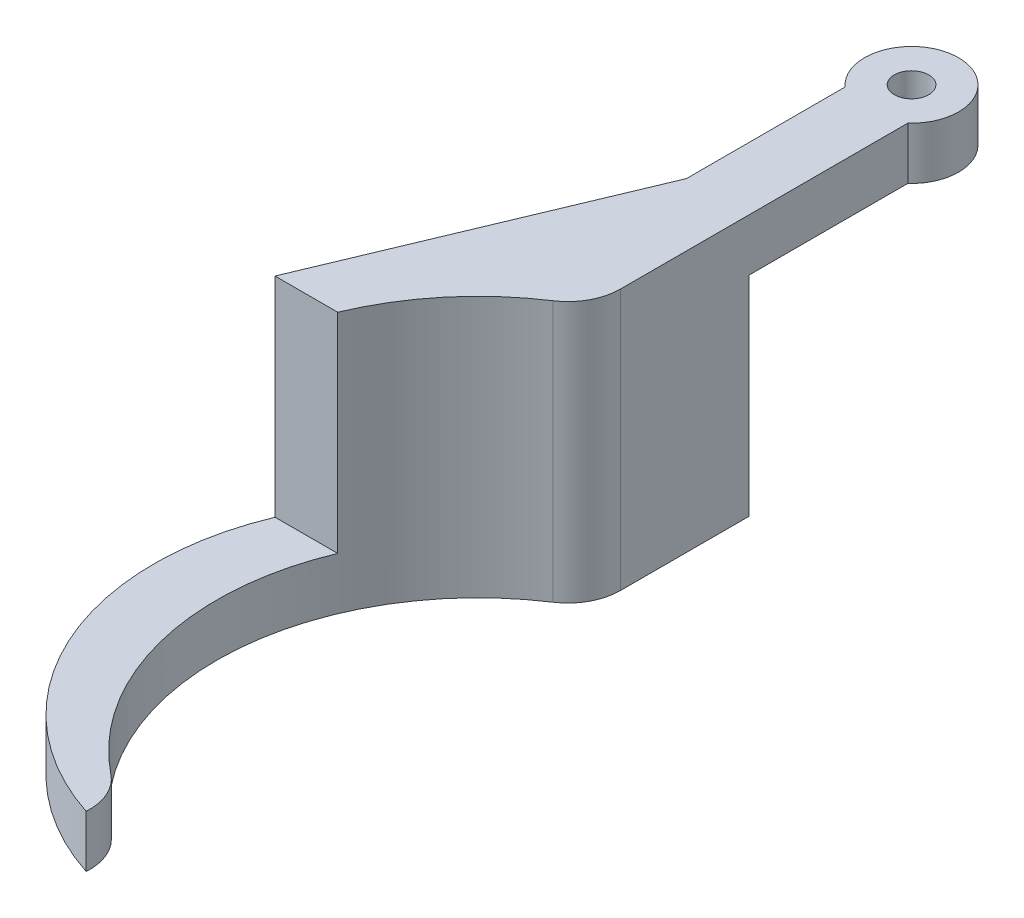
ISO-10303-21;
HEADER;
FILE_DESCRIPTION(('STEP AP214'),'2;1');
FILE_NAME('part.step','',(''),(''),'','','');
FILE_SCHEMA(('AUTOMOTIVE_DESIGN { 1 0 10303 214 1 1 1 1 }'));
ENDSEC;
DATA;
#1=APPLICATION_CONTEXT('core data for automotive mechanical design processes');
#2=APPLICATION_PROTOCOL_DEFINITION('international standard','automotive_design',2000,#1);
#3=PRODUCT_CONTEXT('',#1,'mechanical');
#4=PRODUCT('Part','Part','',(#3));
#5=PRODUCT_RELATED_PRODUCT_CATEGORY('part','',(#4));
#6=PRODUCT_DEFINITION_FORMATION('','',#4);
#7=PRODUCT_DEFINITION_CONTEXT('part definition',#1,'design');
#8=PRODUCT_DEFINITION('design','',#6,#7);
#9=PRODUCT_DEFINITION_SHAPE('','',#8);
#10=(LENGTH_UNIT() NAMED_UNIT(*) SI_UNIT(.MILLI.,.METRE.));
#11=(NAMED_UNIT(*) PLANE_ANGLE_UNIT() SI_UNIT($,.RADIAN.));
#12=(NAMED_UNIT(*) SI_UNIT($,.STERADIAN.) SOLID_ANGLE_UNIT());
#13=UNCERTAINTY_MEASURE_WITH_UNIT(LENGTH_MEASURE(1.E-05),#10,'distance_accuracy_value','');
#14=(GEOMETRIC_REPRESENTATION_CONTEXT(3) GLOBAL_UNCERTAINTY_ASSIGNED_CONTEXT((#13)) GLOBAL_UNIT_ASSIGNED_CONTEXT((#10,
#11,#12)) REPRESENTATION_CONTEXT('',''));
#15=CARTESIAN_POINT('',(0.,0.,0.));
#16=DIRECTION('',(0.,0.,1.));
#17=DIRECTION('',(1.,0.,0.));
#18=AXIS2_PLACEMENT_3D('',#15,#16,#17);
#19=CARTESIAN_POINT('',(0.,0.,0.));
#20=DIRECTION('',(0.,1.,0.));
#21=DIRECTION('',(0.,0.,1.));
#22=AXIS2_PLACEMENT_3D('',#19,#20,#21);
#23=PLANE('',#22);
#24=CARTESIAN_POINT('',(0.,0.,0.));
#25=DIRECTION('',(0.,1.,0.));
#26=DIRECTION('',(0.,0.,1.));
#27=AXIS2_PLACEMENT_3D('',#24,#25,#26);
#28=CIRCLE('',#27,3.);
#29=CARTESIAN_POINT('',(0.,0.,3.));
#30=VERTEX_POINT('',#29);
#31=EDGE_CURVE('E168',#30,#30,#28,.T.);
#32=ORIENTED_EDGE('',*,*,#31,.T.);
#33=EDGE_LOOP('',(#32));
#34=FACE_BOUND('',#33,.T.);
#35=DIRECTION('',(1.,0.,0.));
#36=VECTOR('',#35,1.);
#37=CARTESIAN_POINT('',(-3.,0.,18.5500745429482));
#38=LINE('',#37,#36);
#39=CARTESIAN_POINT('',(-3.,0.,18.5500745429482));
#40=VERTEX_POINT('',#39);
#41=CARTESIAN_POINT('',(3.,0.,18.5500745429482));
#42=VERTEX_POINT('',#41);
#43=EDGE_CURVE('E255',#40,#42,#38,.T.);
#44=ORIENTED_EDGE('',*,*,#43,.F.);
#45=DIRECTION('',(0.,0.,1.));
#46=VECTOR('',#45,1.);
#47=CARTESIAN_POINT('',(-3.,0.,3.35410196624968));
#48=LINE('',#47,#46);
#49=CARTESIAN_POINT('',(-3.,0.,3.35410196624968));
#50=VERTEX_POINT('',#49);
#51=EDGE_CURVE('E175',#50,#40,#48,.T.);
#52=ORIENTED_EDGE('',*,*,#51,.F.);
#53=CARTESIAN_POINT('',(0.,0.,0.));
#54=DIRECTION('',(0.,1.,0.));
#55=DIRECTION('',(0.,0.,1.));
#56=AXIS2_PLACEMENT_3D('',#53,#54,#55);
#57=CIRCLE('',#56,4.5);
#58=CARTESIAN_POINT('',(3.,0.,3.35410196624968));
#59=VERTEX_POINT('',#58);
#60=EDGE_CURVE('E184',#59,#50,#57,.T.);
#61=ORIENTED_EDGE('',*,*,#60,.F.);
#62=DIRECTION('',(0.,0.,-1.));
#63=VECTOR('',#62,1.);
#64=CARTESIAN_POINT('',(3.,0.,3.35410196624968));
#65=LINE('',#64,#63);
#66=EDGE_CURVE('E59',#42,#59,#65,.T.);
#67=ORIENTED_EDGE('',*,*,#66,.F.);
#68=EDGE_LOOP('',(#44,#52,#61,#67));
#69=FACE_BOUND('',#68,.T.);
#70=ADVANCED_FACE('F43',(#34,#69),#23,.F.);
#71=CARTESIAN_POINT('',(3.,5.,3.35410196624968));
#72=DIRECTION('',(-1.,0.,0.));
#73=DIRECTION('',(0.,0.,1.));
#74=AXIS2_PLACEMENT_3D('',#71,#72,#73);
#75=PLANE('',#74);
#76=DIRECTION('',(0.,0.,-1.));
#77=VECTOR('',#76,1.);
#78=CARTESIAN_POINT('',(3.00000000000001,5.,43.8541019662497));
#79=LINE('',#78,#77);
#80=CARTESIAN_POINT('',(3.,5.,30.8819886854511));
#81=VERTEX_POINT('',#80);
#82=CARTESIAN_POINT('',(3.,5.,3.35410196624968));
#83=VERTEX_POINT('',#82);
#84=EDGE_CURVE('E174',#81,#83,#79,.T.);
#85=ORIENTED_EDGE('',*,*,#84,.F.);
#86=DIRECTION('',(0.,-1.,0.));
#87=VECTOR('',#86,1.);
#88=CARTESIAN_POINT('',(3.00000000000001,0.,30.8819886854511));
#89=LINE('',#88,#87);
#90=CARTESIAN_POINT('',(3.00000000000001,-20.,30.8819886854511));
#91=VERTEX_POINT('',#90);
#92=EDGE_CURVE('E11',#81,#91,#89,.T.);
#93=ORIENTED_EDGE('',*,*,#92,.T.);
#94=DIRECTION('',(0.,0.,1.));
#95=VECTOR('',#94,1.);
#96=CARTESIAN_POINT('',(3.,-20.,18.5500745429482));
#97=LINE('',#96,#95);
#98=CARTESIAN_POINT('',(3.,-20.,18.5500745429482));
#99=VERTEX_POINT('',#98);
#100=EDGE_CURVE('E223',#99,#91,#97,.T.);
#101=ORIENTED_EDGE('',*,*,#100,.F.);
#102=DIRECTION('',(0.,1.,0.));
#103=VECTOR('',#102,1.);
#104=CARTESIAN_POINT('',(3.,-15.,18.5500745429482));
#105=LINE('',#104,#103);
#106=EDGE_CURVE('E259',#99,#42,#105,.T.);
#107=ORIENTED_EDGE('',*,*,#106,.T.);
#108=ORIENTED_EDGE('',*,*,#66,.T.);
#109=DIRECTION('',(0.,-1.,0.));
#110=VECTOR('',#109,1.);
#111=CARTESIAN_POINT('',(3.,5.,3.35410196624968));
#112=LINE('',#111,#110);
#113=EDGE_CURVE('E193',#83,#59,#112,.T.);
#114=ORIENTED_EDGE('',*,*,#113,.F.);
#115=EDGE_LOOP('',(#85,#93,#101,#107,#108,#114));
#116=FACE_BOUND('',#115,.T.);
#117=ADVANCED_FACE('F301',(#116),#75,.F.);
#118=CARTESIAN_POINT('',(0.,5.,0.));
#119=DIRECTION('',(0.,-1.,0.));
#120=DIRECTION('',(0.,0.,-1.));
#121=AXIS2_PLACEMENT_3D('',#118,#119,#120);
#122=CYLINDRICAL_SURFACE('',#121,4.5);
#123=ORIENTED_EDGE('',*,*,#60,.T.);
#124=DIRECTION('',(0.,-1.,0.));
#125=VECTOR('',#124,1.);
#126=CARTESIAN_POINT('',(-3.,5.,3.35410196624968));
#127=LINE('',#126,#125);
#128=CARTESIAN_POINT('',(-3.,5.,3.35410196624968));
#129=VERTEX_POINT('',#128);
#130=EDGE_CURVE('E181',#129,#50,#127,.T.);
#131=ORIENTED_EDGE('',*,*,#130,.F.);
#132=CARTESIAN_POINT('',(0.,5.,0.));
#133=DIRECTION('',(0.,1.,0.));
#134=DIRECTION('',(0.,0.,1.));
#135=AXIS2_PLACEMENT_3D('',#132,#133,#134);
#136=CIRCLE('',#135,4.5);
#137=EDGE_CURVE('E178',#83,#129,#136,.T.);
#138=ORIENTED_EDGE('',*,*,#137,.F.);
#139=ORIENTED_EDGE('',*,*,#113,.T.);
#140=EDGE_LOOP('',(#123,#131,#138,#139));
#141=FACE_BOUND('',#140,.T.);
#142=ADVANCED_FACE('F307',(#141),#122,.T.);
#143=CARTESIAN_POINT('',(-3.,5.,3.35410196624968));
#144=DIRECTION('',(1.,0.,0.));
#145=DIRECTION('',(0.,0.,-1.));
#146=AXIS2_PLACEMENT_3D('',#143,#144,#145);
#147=PLANE('',#146);
#148=ORIENTED_EDGE('',*,*,#51,.T.);
#149=DIRECTION('',(0.,1.,0.));
#150=VECTOR('',#149,1.);
#151=CARTESIAN_POINT('',(-3.,0.,18.5500745429482));
#152=LINE('',#151,#150);
#153=CARTESIAN_POINT('',(-3.,5.,18.5500745429482));
#154=VERTEX_POINT('',#153);
#155=EDGE_CURVE('E146',#40,#154,#152,.T.);
#156=ORIENTED_EDGE('',*,*,#155,.T.);
#157=DIRECTION('',(0.,0.,1.));
#158=VECTOR('',#157,1.);
#159=CARTESIAN_POINT('',(-3.,5.,7.41619848709566));
#160=LINE('',#159,#158);
#161=EDGE_CURVE('E141',#129,#154,#160,.T.);
#162=ORIENTED_EDGE('',*,*,#161,.F.);
#163=ORIENTED_EDGE('',*,*,#130,.T.);
#164=EDGE_LOOP('',(#148,#156,#162,#163));
#165=FACE_BOUND('',#164,.T.);
#166=ADVANCED_FACE('F312',(#165),#147,.F.);
#167=CARTESIAN_POINT('',(0.,5.,0.));
#168=DIRECTION('',(0.,1.,0.));
#169=DIRECTION('',(0.,0.,1.));
#170=AXIS2_PLACEMENT_3D('',#167,#168,#169);
#171=PLANE('',#170);
#172=DIRECTION('',(1.,0.,0.));
#173=VECTOR('',#172,1.);
#174=CARTESIAN_POINT('',(-14.6149676840736,5.,46.3249242689621));
#175=LINE('',#174,#173);
#176=CARTESIAN_POINT('',(-14.6149676840736,5.,46.3249242689621));
#177=VERTEX_POINT('',#176);
#178=CARTESIAN_POINT('',(-8.61496768407357,5.,46.3249242689621));
#179=VERTEX_POINT('',#178);
#180=EDGE_CURVE('E124',#177,#179,#175,.T.);
#181=ORIENTED_EDGE('',*,*,#180,.T.);
#182=CARTESIAN_POINT('',(14.4495202218953,5.,55.9700991059163));
#183=DIRECTION('',(0.,-1.,0.));
#184=DIRECTION('',(0.,0.,1.));
#185=AXIS2_PLACEMENT_3D('',#182,#183,#184);
#186=CIRCLE('',#185,25.);
#187=CARTESIAN_POINT('',(0.741586703649219,5.,35.0633404221953));
#188=VERTEX_POINT('',#187);
#189=EDGE_CURVE('E164',#179,#188,#186,.T.);
#190=ORIENTED_EDGE('',*,*,#189,.T.);
#191=CARTESIAN_POINT('',(-1.99999999999999,5.,30.8819886854511));
#192=DIRECTION('',(0.,1.,0.));
#193=DIRECTION('',(0.,0.,1.));
#194=AXIS2_PLACEMENT_3D('',#191,#192,#193);
#195=CIRCLE('',#194,5.);
#196=EDGE_CURVE('E52',#188,#81,#195,.T.);
#197=ORIENTED_EDGE('',*,*,#196,.T.);
#198=ORIENTED_EDGE('',*,*,#84,.T.);
#199=ORIENTED_EDGE('',*,*,#137,.T.);
#200=ORIENTED_EDGE('',*,*,#161,.T.);
#201=DIRECTION('',(-0.38580699347817,0.,0.922579516238755));
#202=VECTOR('',#201,1.);
#203=CARTESIAN_POINT('',(-3.,5.,18.5500745429482));
#204=LINE('',#203,#202);
#205=EDGE_CURVE('E137',#154,#177,#204,.T.);
#206=ORIENTED_EDGE('',*,*,#205,.T.);
#207=EDGE_LOOP('',(#181,#190,#197,#198,#199,#200,#206));
#208=FACE_BOUND('',#207,.T.);
#209=CARTESIAN_POINT('',(0.,5.,0.));
#210=DIRECTION('',(0.,1.,0.));
#211=DIRECTION('',(0.,0.,1.));
#212=AXIS2_PLACEMENT_3D('',#209,#210,#211);
#213=CIRCLE('',#212,1.65);
#214=CARTESIAN_POINT('',(0.,5.,1.65));
#215=VERTEX_POINT('',#214);
#216=EDGE_CURVE('E167',#215,#215,#213,.T.);
#217=ORIENTED_EDGE('',*,*,#216,.F.);
#218=EDGE_LOOP('',(#217));
#219=FACE_BOUND('',#218,.T.);
#220=ADVANCED_FACE('F138',(#208,#219),#171,.T.);
#221=CARTESIAN_POINT('',(0.,-4.66690475583121,0.));
#222=DIRECTION('',(0.,1.,0.));
#223=DIRECTION('',(0.,0.,1.));
#224=AXIS2_PLACEMENT_3D('',#221,#222,#223);
#225=CYLINDRICAL_SURFACE('',#224,1.65);
#226=CARTESIAN_POINT('',(0.,0.5,0.));
#227=DIRECTION('',(0.,1.,0.));
#228=DIRECTION('',(0.,0.,1.));
#229=AXIS2_PLACEMENT_3D('',#226,#227,#228);
#230=CIRCLE('',#229,1.65);
#231=CARTESIAN_POINT('',(0.,0.5,1.65));
#232=VERTEX_POINT('',#231);
#233=EDGE_CURVE('E159',#232,#232,#230,.F.);
#234=ORIENTED_EDGE('',*,*,#233,.T.);
#235=EDGE_LOOP('',(#234));
#236=FACE_BOUND('',#235,.T.);
#237=ORIENTED_EDGE('',*,*,#216,.T.);
#238=EDGE_LOOP('',(#237));
#239=FACE_BOUND('',#238,.T.);
#240=ADVANCED_FACE('F337',(#236,#239),#225,.F.);
#241=CARTESIAN_POINT('',(14.4495202218953,0.,55.9700991059163));
#242=DIRECTION('',(0.,1.,0.));
#243=DIRECTION('',(0.,0.,1.));
#244=AXIS2_PLACEMENT_3D('',#241,#242,#243);
#245=CYLINDRICAL_SURFACE('',#244,25.);
#246=ORIENTED_EDGE('',*,*,#189,.F.);
#247=DIRECTION('',(0.,1.,0.));
#248=VECTOR('',#247,1.);
#249=CARTESIAN_POINT('',(-8.61496768407357,-15.,46.3249242689621));
#250=LINE('',#249,#248);
#251=CARTESIAN_POINT('',(-8.61496768407357,-15.,46.3249242689621));
#252=VERTEX_POINT('',#251);
#253=EDGE_CURVE('E131',#252,#179,#250,.T.);
#254=ORIENTED_EDGE('',*,*,#253,.F.);
#255=CARTESIAN_POINT('',(14.4495202218953,-15.,55.9700991059163));
#256=DIRECTION('',(0.,1.,0.));
#257=DIRECTION('',(0.,0.,-1.));
#258=AXIS2_PLACEMENT_3D('',#255,#256,#257);
#259=CIRCLE('',#258,25.);
#260=CARTESIAN_POINT('',(-1.14724087166776,-15.,75.5082935821293));
#261=VERTEX_POINT('',#260);
#262=EDGE_CURVE('E239',#252,#261,#259,.T.);
#263=ORIENTED_EDGE('',*,*,#262,.T.);
#264=DIRECTION('',(0.,1.,0.));
#265=VECTOR('',#264,1.);
#266=CARTESIAN_POINT('',(-1.14724087166776,-20.,75.5082935821293));
#267=LINE('',#266,#265);
#268=CARTESIAN_POINT('',(-1.14724087166776,-20.,75.5082935821293));
#269=VERTEX_POINT('',#268);
#270=EDGE_CURVE('E249',#269,#261,#267,.T.);
#271=ORIENTED_EDGE('',*,*,#270,.F.);
#272=CARTESIAN_POINT('',(14.4495202218953,-20.,55.9700991059163));
#273=DIRECTION('',(0.,1.,0.));
#274=DIRECTION('',(0.,0.,-1.));
#275=AXIS2_PLACEMENT_3D('',#272,#273,#274);
#276=CIRCLE('',#275,25.);
#277=CARTESIAN_POINT('',(0.741586703649214,-20.,35.0633404221953));
#278=VERTEX_POINT('',#277);
#279=EDGE_CURVE('E211',#278,#269,#276,.T.);
#280=ORIENTED_EDGE('',*,*,#279,.F.);
#281=DIRECTION('',(0.,1.,0.));
#282=VECTOR('',#281,1.);
#283=CARTESIAN_POINT('',(0.741586703649219,0.,35.0633404221953));
#284=LINE('',#283,#282);
#285=EDGE_CURVE('E197',#278,#188,#284,.T.);
#286=ORIENTED_EDGE('',*,*,#285,.T.);
#287=EDGE_LOOP('',(#246,#254,#263,#271,#280,#286));
#288=FACE_BOUND('',#287,.T.);
#289=ADVANCED_FACE('F209',(#288),#245,.F.);
#290=CARTESIAN_POINT('',(0.,-2.5,0.));
#291=DIRECTION('',(0.,1.,0.));
#292=DIRECTION('',(0.,0.,1.));
#293=AXIS2_PLACEMENT_3D('',#290,#291,#292);
#294=CYLINDRICAL_SURFACE('',#293,3.);
#295=CARTESIAN_POINT('',(0.,0.5,0.));
#296=DIRECTION('',(0.,1.,0.));
#297=DIRECTION('',(0.,0.,1.));
#298=AXIS2_PLACEMENT_3D('',#295,#296,#297);
#299=CIRCLE('',#298,3.);
#300=CARTESIAN_POINT('',(0.,0.5,3.));
#301=VERTEX_POINT('',#300);
#302=EDGE_CURVE('E154',#301,#301,#299,.T.);
#303=ORIENTED_EDGE('',*,*,#302,.T.);
#304=EDGE_LOOP('',(#303));
#305=FACE_BOUND('',#304,.T.);
#306=ORIENTED_EDGE('',*,*,#31,.F.);
#307=EDGE_LOOP('',(#306));
#308=FACE_BOUND('',#307,.T.);
#309=ADVANCED_FACE('F350',(#305,#308),#294,.F.);
#310=CARTESIAN_POINT('',(0.,0.5,0.));
#311=DIRECTION('',(0.,1.,0.));
#312=DIRECTION('',(0.,0.,1.));
#313=AXIS2_PLACEMENT_3D('',#310,#311,#312);
#314=PLANE('',#313);
#315=ORIENTED_EDGE('',*,*,#302,.F.);
#316=EDGE_LOOP('',(#315));
#317=FACE_BOUND('',#316,.T.);
#318=ORIENTED_EDGE('',*,*,#233,.F.);
#319=EDGE_LOOP('',(#318));
#320=FACE_BOUND('',#319,.T.);
#321=ADVANCED_FACE('F357',(#317,#320),#314,.F.);
#322=CARTESIAN_POINT('',(-3.,0.,18.5500745429482));
#323=DIRECTION('',(-0.922579516238755,0.,-0.38580699347817));
#324=DIRECTION('',(-0.38580699347817,0.,0.922579516238755));
#325=AXIS2_PLACEMENT_3D('',#322,#323,#324);
#326=PLANE('',#325);
#327=ORIENTED_EDGE('',*,*,#205,.F.);
#328=ORIENTED_EDGE('',*,*,#155,.F.);
#329=DIRECTION('',(0.,1.,0.));
#330=VECTOR('',#329,1.);
#331=CARTESIAN_POINT('',(-3.,-15.,18.5500745429482));
#332=LINE('',#331,#330);
#333=CARTESIAN_POINT('',(-3.,-20.,18.5500745429482));
#334=VERTEX_POINT('',#333);
#335=EDGE_CURVE('E265',#334,#40,#332,.T.);
#336=ORIENTED_EDGE('',*,*,#335,.F.);
#337=DIRECTION('',(0.38580699347817,0.,-0.922579516238755));
#338=VECTOR('',#337,1.);
#339=CARTESIAN_POINT('',(-14.6149676840736,-20.,46.3249242689621));
#340=LINE('',#339,#338);
#341=CARTESIAN_POINT('',(-14.6149676840736,-20.,46.3249242689621));
#342=VERTEX_POINT('',#341);
#343=EDGE_CURVE('E273',#342,#334,#340,.T.);
#344=ORIENTED_EDGE('',*,*,#343,.F.);
#345=DIRECTION('',(0.,1.,0.));
#346=VECTOR('',#345,1.);
#347=CARTESIAN_POINT('',(-14.6149676840736,-20.,46.3249242689621));
#348=LINE('',#347,#346);
#349=CARTESIAN_POINT('',(-14.6149676840736,-15.,46.3249242689621));
#350=VERTEX_POINT('',#349);
#351=EDGE_CURVE('E151',#342,#350,#348,.T.);
#352=ORIENTED_EDGE('',*,*,#351,.T.);
#353=DIRECTION('',(0.,1.,0.));
#354=VECTOR('',#353,1.);
#355=CARTESIAN_POINT('',(-14.6149676840736,0.,46.3249242689621));
#356=LINE('',#355,#354);
#357=EDGE_CURVE('E129',#350,#177,#356,.T.);
#358=ORIENTED_EDGE('',*,*,#357,.T.);
#359=EDGE_LOOP('',(#327,#328,#336,#344,#352,#358));
#360=FACE_BOUND('',#359,.T.);
#361=ADVANCED_FACE('F149',(#360),#326,.T.);
#362=CARTESIAN_POINT('',(-1.99999999999999,0.,30.8819886854511));
#363=DIRECTION('',(0.,1.,0.));
#364=DIRECTION('',(0.,0.,1.));
#365=AXIS2_PLACEMENT_3D('',#362,#363,#364);
#366=CYLINDRICAL_SURFACE('',#365,5.);
#367=ORIENTED_EDGE('',*,*,#285,.F.);
#368=CARTESIAN_POINT('',(-1.99999999999999,-20.,30.8819886854511));
#369=DIRECTION('',(0.,-1.,0.));
#370=DIRECTION('',(0.,0.,-1.));
#371=AXIS2_PLACEMENT_3D('',#368,#369,#370);
#372=CIRCLE('',#371,5.);
#373=EDGE_CURVE('E216',#91,#278,#372,.T.);
#374=ORIENTED_EDGE('',*,*,#373,.F.);
#375=ORIENTED_EDGE('',*,*,#92,.F.);
#376=ORIENTED_EDGE('',*,*,#196,.F.);
#377=EDGE_LOOP('',(#367,#374,#375,#376));
#378=FACE_BOUND('',#377,.T.);
#379=ADVANCED_FACE('F45',(#378),#366,.T.);
#380=CARTESIAN_POINT('',(-14.6149676840736,-15.,46.3249242689621));
#381=DIRECTION('',(0.,0.,-1.));
#382=DIRECTION('',(-1.,0.,0.));
#383=AXIS2_PLACEMENT_3D('',#380,#381,#382);
#384=PLANE('',#383);
#385=ORIENTED_EDGE('',*,*,#253,.T.);
#386=ORIENTED_EDGE('',*,*,#180,.F.);
#387=ORIENTED_EDGE('',*,*,#357,.F.);
#388=DIRECTION('',(-1.,0.,0.));
#389=VECTOR('',#388,1.);
#390=CARTESIAN_POINT('',(-14.6149676840736,-15.,46.3249242689621));
#391=LINE('',#390,#389);
#392=EDGE_CURVE('E256',#252,#350,#391,.T.);
#393=ORIENTED_EDGE('',*,*,#392,.F.);
#394=EDGE_LOOP('',(#385,#386,#387,#393));
#395=FACE_BOUND('',#394,.T.);
#396=ADVANCED_FACE('F126',(#395),#384,.F.);
#397=CARTESIAN_POINT('',(-3.,-15.,18.5500745429482));
#398=DIRECTION('',(0.,0.,1.));
#399=DIRECTION('',(1.,0.,0.));
#400=AXIS2_PLACEMENT_3D('',#397,#398,#399);
#401=PLANE('',#400);
#402=ORIENTED_EDGE('',*,*,#43,.T.);
#403=ORIENTED_EDGE('',*,*,#106,.F.);
#404=DIRECTION('',(1.,0.,0.));
#405=VECTOR('',#404,1.);
#406=CARTESIAN_POINT('',(-3.,-20.,18.5500745429482));
#407=LINE('',#406,#405);
#408=EDGE_CURVE('E230',#334,#99,#407,.T.);
#409=ORIENTED_EDGE('',*,*,#408,.F.);
#410=ORIENTED_EDGE('',*,*,#335,.T.);
#411=EDGE_LOOP('',(#402,#403,#409,#410));
#412=FACE_BOUND('',#411,.T.);
#413=ADVANCED_FACE('F271',(#412),#401,.F.);
#414=CARTESIAN_POINT('',(8.4495202218953,-20.,55.9700991059163));
#415=DIRECTION('',(0.,1.,0.));
#416=DIRECTION('',(0.,0.,1.));
#417=AXIS2_PLACEMENT_3D('',#414,#415,#416);
#418=CYLINDRICAL_SURFACE('',#417,25.);
#419=CARTESIAN_POINT('',(8.4495202218953,-15.,55.9700991059163));
#420=DIRECTION('',(0.,-1.,0.));
#421=DIRECTION('',(0.,0.,-1.));
#422=AXIS2_PLACEMENT_3D('',#419,#420,#421);
#423=CIRCLE('',#422,25.);
#424=CARTESIAN_POINT('',(0.72250096125798,-15.,79.7459939018171));
#425=VERTEX_POINT('',#424);
#426=EDGE_CURVE('E134',#425,#350,#423,.T.);
#427=ORIENTED_EDGE('',*,*,#426,.T.);
#428=ORIENTED_EDGE('',*,*,#351,.F.);
#429=CARTESIAN_POINT('',(8.4495202218953,-20.,55.9700991059163));
#430=DIRECTION('',(0.,-1.,0.));
#431=DIRECTION('',(0.,0.,-1.));
#432=AXIS2_PLACEMENT_3D('',#429,#430,#431);
#433=CIRCLE('',#432,25.);
#434=CARTESIAN_POINT('',(0.72250096125798,-20.,79.7459939018171));
#435=VERTEX_POINT('',#434);
#436=EDGE_CURVE('E245',#435,#342,#433,.T.);
#437=ORIENTED_EDGE('',*,*,#436,.F.);
#438=DIRECTION('',(0.,1.,0.));
#439=VECTOR('',#438,1.);
#440=CARTESIAN_POINT('',(0.72250096125798,-20.,79.7459939018171));
#441=LINE('',#440,#439);
#442=EDGE_CURVE('E236',#435,#425,#441,.T.);
#443=ORIENTED_EDGE('',*,*,#442,.T.);
#444=EDGE_LOOP('',(#427,#428,#437,#443));
#445=FACE_BOUND('',#444,.T.);
#446=ADVANCED_FACE('F283',(#445),#418,.T.);
#447=CARTESIAN_POINT('',(-4.26659309038037,-20.,79.4159324773719));
#448=DIRECTION('',(0.,1.,0.));
#449=DIRECTION('',(0.,0.,1.));
#450=AXIS2_PLACEMENT_3D('',#447,#448,#449);
#451=CYLINDRICAL_SURFACE('',#450,5.);
#452=CARTESIAN_POINT('',(-4.26659309038037,-15.,79.4159324773719));
#453=DIRECTION('',(0.,-1.,0.));
#454=DIRECTION('',(0.,0.,-1.));
#455=AXIS2_PLACEMENT_3D('',#452,#453,#454);
#456=CIRCLE('',#455,5.);
#457=EDGE_CURVE('E242',#261,#425,#456,.T.);
#458=ORIENTED_EDGE('',*,*,#457,.T.);
#459=ORIENTED_EDGE('',*,*,#442,.F.);
#460=CARTESIAN_POINT('',(-4.26659309038037,-20.,79.4159324773719));
#461=DIRECTION('',(0.,-1.,0.));
#462=DIRECTION('',(0.,0.,-1.));
#463=AXIS2_PLACEMENT_3D('',#460,#461,#462);
#464=CIRCLE('',#463,5.);
#465=EDGE_CURVE('E228',#269,#435,#464,.T.);
#466=ORIENTED_EDGE('',*,*,#465,.F.);
#467=ORIENTED_EDGE('',*,*,#270,.T.);
#468=EDGE_LOOP('',(#458,#459,#466,#467));
#469=FACE_BOUND('',#468,.T.);
#470=ADVANCED_FACE('F290',(#469),#451,.T.);
#471=CARTESIAN_POINT('',(8.4495202218953,-20.,55.9700991059163));
#472=DIRECTION('',(0.,-1.,0.));
#473=DIRECTION('',(0.,0.,-1.));
#474=AXIS2_PLACEMENT_3D('',#471,#472,#473);
#475=PLANE('',#474);
#476=ORIENTED_EDGE('',*,*,#436,.T.);
#477=ORIENTED_EDGE('',*,*,#343,.T.);
#478=ORIENTED_EDGE('',*,*,#408,.T.);
#479=ORIENTED_EDGE('',*,*,#100,.T.);
#480=ORIENTED_EDGE('',*,*,#373,.T.);
#481=ORIENTED_EDGE('',*,*,#279,.T.);
#482=ORIENTED_EDGE('',*,*,#465,.T.);
#483=EDGE_LOOP('',(#476,#477,#478,#479,#480,#481,#482));
#484=FACE_BOUND('',#483,.T.);
#485=ADVANCED_FACE('F220',(#484),#475,.T.);
#486=CARTESIAN_POINT('',(8.4495202218953,-15.,55.9700991059163));
#487=DIRECTION('',(0.,-1.,0.));
#488=DIRECTION('',(0.,0.,-1.));
#489=AXIS2_PLACEMENT_3D('',#486,#487,#488);
#490=PLANE('',#489);
#491=ORIENTED_EDGE('',*,*,#262,.F.);
#492=ORIENTED_EDGE('',*,*,#392,.T.);
#493=ORIENTED_EDGE('',*,*,#426,.F.);
#494=ORIENTED_EDGE('',*,*,#457,.F.);
#495=EDGE_LOOP('',(#491,#492,#493,#494));
#496=FACE_BOUND('',#495,.T.);
#497=ADVANCED_FACE('F288',(#496),#490,.F.);
#498=CLOSED_SHELL('',(#70,#117,#142,#166,#220,#240,#289,#309,#321,#361,#379,#396,#413,#446,#470,
#485,#497));
#499=MANIFOLD_SOLID_BREP('B2',#498);
#500=ADVANCED_BREP_SHAPE_REPRESENTATION('',(#18,#499),#14);
#501=SHAPE_DEFINITION_REPRESENTATION(#9,#500);
ENDSEC;
END-ISO-10303-21;
